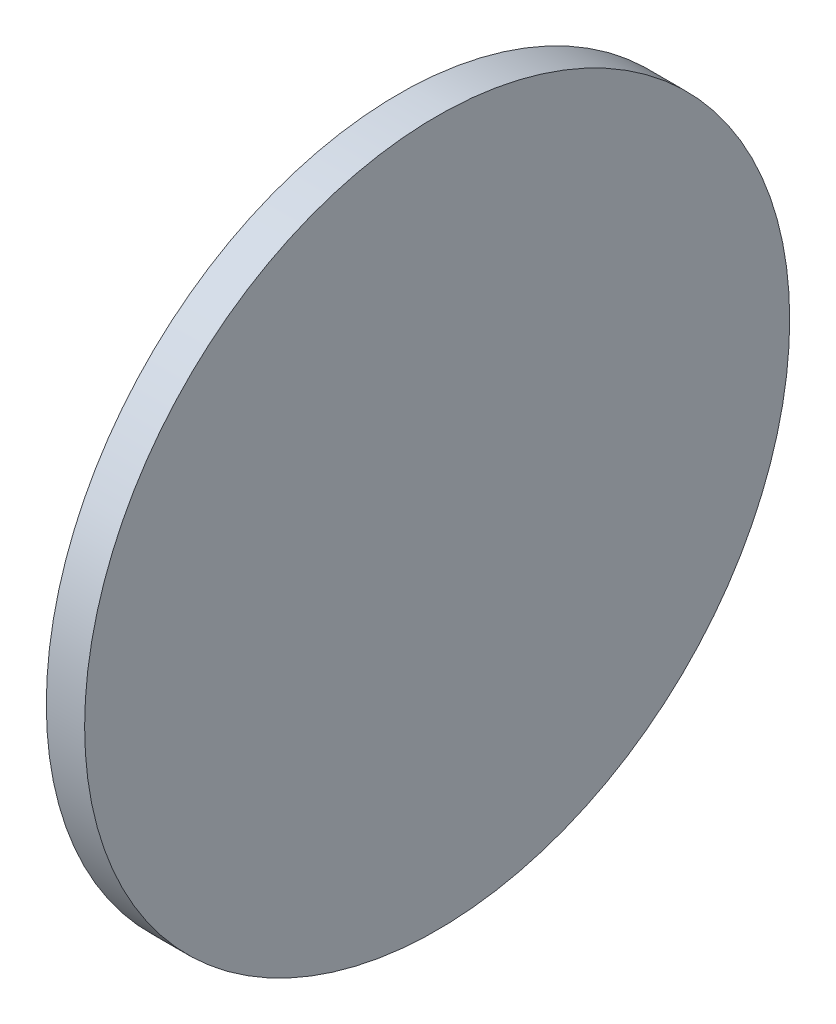
ISO-10303-21;
HEADER;
FILE_DESCRIPTION(('STEP AP214'),'2;1');
FILE_NAME('part.step','',(''),(''),'','','');
FILE_SCHEMA(('AUTOMOTIVE_DESIGN { 1 0 10303 214 1 1 1 1 }'));
ENDSEC;
DATA;
#1=APPLICATION_CONTEXT('core data for automotive mechanical design processes');
#2=APPLICATION_PROTOCOL_DEFINITION('international standard','automotive_design',2000,#1);
#3=PRODUCT_CONTEXT('',#1,'mechanical');
#4=PRODUCT('Part','Part','',(#3));
#5=PRODUCT_RELATED_PRODUCT_CATEGORY('part','',(#4));
#6=PRODUCT_DEFINITION_FORMATION('','',#4);
#7=PRODUCT_DEFINITION_CONTEXT('part definition',#1,'design');
#8=PRODUCT_DEFINITION('design','',#6,#7);
#9=PRODUCT_DEFINITION_SHAPE('','',#8);
#10=(LENGTH_UNIT() NAMED_UNIT(*) SI_UNIT(.MILLI.,.METRE.));
#11=(NAMED_UNIT(*) PLANE_ANGLE_UNIT() SI_UNIT($,.RADIAN.));
#12=(NAMED_UNIT(*) SI_UNIT($,.STERADIAN.) SOLID_ANGLE_UNIT());
#13=UNCERTAINTY_MEASURE_WITH_UNIT(LENGTH_MEASURE(1.E-05),#10,'distance_accuracy_value','');
#14=(GEOMETRIC_REPRESENTATION_CONTEXT(3) GLOBAL_UNCERTAINTY_ASSIGNED_CONTEXT((#13)) GLOBAL_UNIT_ASSIGNED_CONTEXT((#10,
#11,#12)) REPRESENTATION_CONTEXT('',''));
#15=CARTESIAN_POINT('',(0.,0.,0.));
#16=DIRECTION('',(0.,0.,1.));
#17=DIRECTION('',(1.,0.,0.));
#18=AXIS2_PLACEMENT_3D('',#15,#16,#17);
#19=CARTESIAN_POINT('',(52.33,0.,0.));
#20=DIRECTION('',(-1.,0.,0.));
#21=DIRECTION('',(0.,0.,1.));
#22=AXIS2_PLACEMENT_3D('',#19,#20,#21);
#23=PLANE('',#22);
#24=CARTESIAN_POINT('',(52.33,0.,0.));
#25=DIRECTION('',(-1.,0.,0.));
#26=DIRECTION('',(0.,0.,1.));
#27=AXIS2_PLACEMENT_3D('',#24,#25,#26);
#28=CIRCLE('',#27,4.6);
#29=CARTESIAN_POINT('',(52.33,0.,4.6));
#30=VERTEX_POINT('',#29);
#31=EDGE_CURVE('E18',#30,#30,#28,.F.);
#32=ORIENTED_EDGE('',*,*,#31,.F.);
#33=EDGE_LOOP('',(#32));
#34=FACE_BOUND('',#33,.T.);
#35=ADVANCED_FACE('F15',(#34),#23,.T.);
#36=CARTESIAN_POINT('',(52.58,0.,0.));
#37=DIRECTION('',(-1.,0.,0.));
#38=DIRECTION('',(0.,0.,1.));
#39=AXIS2_PLACEMENT_3D('',#36,#37,#38);
#40=CYLINDRICAL_SURFACE('',#39,4.6);
#41=CARTESIAN_POINT('',(52.83,0.,0.));
#42=DIRECTION('',(-1.,0.,0.));
#43=DIRECTION('',(0.,0.,1.));
#44=AXIS2_PLACEMENT_3D('',#41,#42,#43);
#45=CIRCLE('',#44,4.6);
#46=CARTESIAN_POINT('',(52.83,0.,4.6));
#47=VERTEX_POINT('',#46);
#48=EDGE_CURVE('E10',#47,#47,#45,.F.);
#49=ORIENTED_EDGE('',*,*,#48,.F.);
#50=EDGE_LOOP('',(#49));
#51=FACE_BOUND('',#50,.T.);
#52=ORIENTED_EDGE('',*,*,#31,.T.);
#53=EDGE_LOOP('',(#52));
#54=FACE_BOUND('',#53,.T.);
#55=ADVANCED_FACE('F27',(#51,#54),#40,.T.);
#56=CARTESIAN_POINT('',(52.83,0.,0.));
#57=DIRECTION('',(1.,0.,0.));
#58=DIRECTION('',(0.,0.,-1.));
#59=AXIS2_PLACEMENT_3D('',#56,#57,#58);
#60=PLANE('',#59);
#61=ORIENTED_EDGE('',*,*,#48,.T.);
#62=EDGE_LOOP('',(#61));
#63=FACE_BOUND('',#62,.T.);
#64=ADVANCED_FACE('F34',(#63),#60,.T.);
#65=CLOSED_SHELL('',(#35,#55,#64));
#66=MANIFOLD_SOLID_BREP('B1',#65);
#67=ADVANCED_BREP_SHAPE_REPRESENTATION('',(#18,#66),#14);
#68=SHAPE_DEFINITION_REPRESENTATION(#9,#67);
ENDSEC;
END-ISO-10303-21;
